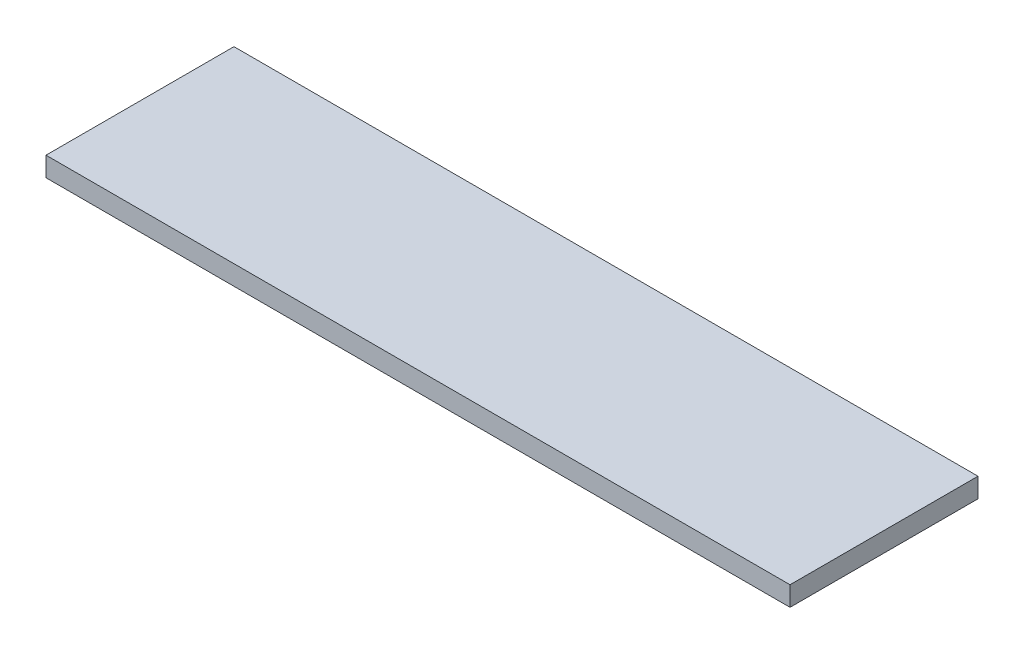
ISO-10303-21;
HEADER;
FILE_DESCRIPTION(('STEP AP214'),'2;1');
FILE_NAME('part.step','',(''),(''),'','','');
FILE_SCHEMA(('AUTOMOTIVE_DESIGN { 1 0 10303 214 1 1 1 1 }'));
ENDSEC;
DATA;
#1=APPLICATION_CONTEXT('core data for automotive mechanical design processes');
#2=APPLICATION_PROTOCOL_DEFINITION('international standard','automotive_design',2000,#1);
#3=PRODUCT_CONTEXT('',#1,'mechanical');
#4=PRODUCT('Part','Part','',(#3));
#5=PRODUCT_RELATED_PRODUCT_CATEGORY('part','',(#4));
#6=PRODUCT_DEFINITION_FORMATION('','',#4);
#7=PRODUCT_DEFINITION_CONTEXT('part definition',#1,'design');
#8=PRODUCT_DEFINITION('design','',#6,#7);
#9=PRODUCT_DEFINITION_SHAPE('','',#8);
#10=(LENGTH_UNIT() NAMED_UNIT(*) SI_UNIT(.MILLI.,.METRE.));
#11=(NAMED_UNIT(*) PLANE_ANGLE_UNIT() SI_UNIT($,.RADIAN.));
#12=(NAMED_UNIT(*) SI_UNIT($,.STERADIAN.) SOLID_ANGLE_UNIT());
#13=UNCERTAINTY_MEASURE_WITH_UNIT(LENGTH_MEASURE(1.E-05),#10,'distance_accuracy_value','');
#14=(GEOMETRIC_REPRESENTATION_CONTEXT(3) GLOBAL_UNCERTAINTY_ASSIGNED_CONTEXT((#13)) GLOBAL_UNIT_ASSIGNED_CONTEXT((#10,
#11,#12)) REPRESENTATION_CONTEXT('',''));
#15=CARTESIAN_POINT('',(0.,0.,0.));
#16=DIRECTION('',(0.,0.,1.));
#17=DIRECTION('',(1.,0.,0.));
#18=AXIS2_PLACEMENT_3D('',#15,#16,#17);
#19=CARTESIAN_POINT('',(2413.,127.,-609.6));
#20=DIRECTION('',(-1.,0.,0.));
#21=DIRECTION('',(0.,0.,1.));
#22=AXIS2_PLACEMENT_3D('',#19,#20,#21);
#23=PLANE('',#22);
#24=DIRECTION('',(0.,0.,-1.));
#25=VECTOR('',#24,1.);
#26=CARTESIAN_POINT('',(2413.,0.,-609.6));
#27=LINE('',#26,#25);
#28=CARTESIAN_POINT('',(2413.,0.,609.6));
#29=VERTEX_POINT('',#28);
#30=CARTESIAN_POINT('',(2413.,0.,-609.6));
#31=VERTEX_POINT('',#30);
#32=EDGE_CURVE('E106',#29,#31,#27,.T.);
#33=ORIENTED_EDGE('',*,*,#32,.T.);
#34=DIRECTION('',(0.,-1.,0.));
#35=VECTOR('',#34,1.);
#36=CARTESIAN_POINT('',(2413.,127.,-609.6));
#37=LINE('',#36,#35);
#38=CARTESIAN_POINT('',(2413.,127.,-609.6));
#39=VERTEX_POINT('',#38);
#40=EDGE_CURVE('E11',#39,#31,#37,.T.);
#41=ORIENTED_EDGE('',*,*,#40,.F.);
#42=DIRECTION('',(0.,0.,-1.));
#43=VECTOR('',#42,1.);
#44=CARTESIAN_POINT('',(2413.,127.,-609.6));
#45=LINE('',#44,#43);
#46=CARTESIAN_POINT('',(2413.,127.,609.6));
#47=VERTEX_POINT('',#46);
#48=EDGE_CURVE('E90',#47,#39,#45,.T.);
#49=ORIENTED_EDGE('',*,*,#48,.F.);
#50=DIRECTION('',(0.,-1.,0.));
#51=VECTOR('',#50,1.);
#52=CARTESIAN_POINT('',(2413.,127.,609.6));
#53=LINE('',#52,#51);
#54=EDGE_CURVE('E102',#47,#29,#53,.T.);
#55=ORIENTED_EDGE('',*,*,#54,.T.);
#56=EDGE_LOOP('',(#33,#41,#49,#55));
#57=FACE_BOUND('',#56,.T.);
#58=ADVANCED_FACE('F38',(#57),#23,.F.);
#59=CARTESIAN_POINT('',(-2413.,127.,-609.6));
#60=DIRECTION('',(0.,0.,1.));
#61=DIRECTION('',(1.,0.,0.));
#62=AXIS2_PLACEMENT_3D('',#59,#60,#61);
#63=PLANE('',#62);
#64=DIRECTION('',(-1.,0.,0.));
#65=VECTOR('',#64,1.);
#66=CARTESIAN_POINT('',(-2413.,0.,-609.6));
#67=LINE('',#66,#65);
#68=CARTESIAN_POINT('',(-2413.,0.,-609.6));
#69=VERTEX_POINT('',#68);
#70=EDGE_CURVE('E95',#31,#69,#67,.T.);
#71=ORIENTED_EDGE('',*,*,#70,.T.);
#72=DIRECTION('',(0.,-1.,0.));
#73=VECTOR('',#72,1.);
#74=CARTESIAN_POINT('',(-2413.,127.,-609.6));
#75=LINE('',#74,#73);
#76=CARTESIAN_POINT('',(-2413.,127.,-609.6));
#77=VERTEX_POINT('',#76);
#78=EDGE_CURVE('E47',#77,#69,#75,.T.);
#79=ORIENTED_EDGE('',*,*,#78,.F.);
#80=DIRECTION('',(-1.,0.,0.));
#81=VECTOR('',#80,1.);
#82=CARTESIAN_POINT('',(-2413.,127.,-609.6));
#83=LINE('',#82,#81);
#84=EDGE_CURVE('E85',#39,#77,#83,.T.);
#85=ORIENTED_EDGE('',*,*,#84,.F.);
#86=ORIENTED_EDGE('',*,*,#40,.T.);
#87=EDGE_LOOP('',(#71,#79,#85,#86));
#88=FACE_BOUND('',#87,.T.);
#89=ADVANCED_FACE('F94',(#88),#63,.F.);
#90=CARTESIAN_POINT('',(-2413.,127.,-609.6));
#91=DIRECTION('',(1.,0.,0.));
#92=DIRECTION('',(0.,0.,-1.));
#93=AXIS2_PLACEMENT_3D('',#90,#91,#92);
#94=PLANE('',#93);
#95=DIRECTION('',(0.,0.,1.));
#96=VECTOR('',#95,1.);
#97=CARTESIAN_POINT('',(-2413.,0.,-609.6));
#98=LINE('',#97,#96);
#99=CARTESIAN_POINT('',(-2413.,0.,609.6));
#100=VERTEX_POINT('',#99);
#101=EDGE_CURVE('E72',#69,#100,#98,.T.);
#102=ORIENTED_EDGE('',*,*,#101,.T.);
#103=DIRECTION('',(0.,-1.,0.));
#104=VECTOR('',#103,1.);
#105=CARTESIAN_POINT('',(-2413.,127.,609.6));
#106=LINE('',#105,#104);
#107=CARTESIAN_POINT('',(-2413.,127.,609.6));
#108=VERTEX_POINT('',#107);
#109=EDGE_CURVE('E97',#108,#100,#106,.T.);
#110=ORIENTED_EDGE('',*,*,#109,.F.);
#111=DIRECTION('',(0.,0.,1.));
#112=VECTOR('',#111,1.);
#113=CARTESIAN_POINT('',(-2413.,127.,-609.6));
#114=LINE('',#113,#112);
#115=EDGE_CURVE('E88',#77,#108,#114,.T.);
#116=ORIENTED_EDGE('',*,*,#115,.F.);
#117=ORIENTED_EDGE('',*,*,#78,.T.);
#118=EDGE_LOOP('',(#102,#110,#116,#117));
#119=FACE_BOUND('',#118,.T.);
#120=ADVANCED_FACE('F98',(#119),#94,.F.);
#121=CARTESIAN_POINT('',(-2413.,127.,609.6));
#122=DIRECTION('',(0.,0.,-1.));
#123=DIRECTION('',(-1.,0.,0.));
#124=AXIS2_PLACEMENT_3D('',#121,#122,#123);
#125=PLANE('',#124);
#126=DIRECTION('',(1.,0.,0.));
#127=VECTOR('',#126,1.);
#128=CARTESIAN_POINT('',(-2413.,0.,609.6));
#129=LINE('',#128,#127);
#130=EDGE_CURVE('E78',#100,#29,#129,.T.);
#131=ORIENTED_EDGE('',*,*,#130,.T.);
#132=ORIENTED_EDGE('',*,*,#54,.F.);
#133=DIRECTION('',(1.,0.,0.));
#134=VECTOR('',#133,1.);
#135=CARTESIAN_POINT('',(-2413.,127.,609.6));
#136=LINE('',#135,#134);
#137=EDGE_CURVE('E55',#108,#47,#136,.T.);
#138=ORIENTED_EDGE('',*,*,#137,.F.);
#139=ORIENTED_EDGE('',*,*,#109,.T.);
#140=EDGE_LOOP('',(#131,#132,#138,#139));
#141=FACE_BOUND('',#140,.T.);
#142=ADVANCED_FACE('F119',(#141),#125,.F.);
#143=CARTESIAN_POINT('',(0.,127.,0.));
#144=DIRECTION('',(0.,1.,0.));
#145=DIRECTION('',(0.,0.,1.));
#146=AXIS2_PLACEMENT_3D('',#143,#144,#145);
#147=PLANE('',#146);
#148=ORIENTED_EDGE('',*,*,#48,.T.);
#149=ORIENTED_EDGE('',*,*,#84,.T.);
#150=ORIENTED_EDGE('',*,*,#115,.T.);
#151=ORIENTED_EDGE('',*,*,#137,.T.);
#152=EDGE_LOOP('',(#148,#149,#150,#151));
#153=FACE_BOUND('',#152,.T.);
#154=ADVANCED_FACE('F86',(#153),#147,.T.);
#155=CARTESIAN_POINT('',(0.,0.,0.));
#156=DIRECTION('',(0.,1.,0.));
#157=DIRECTION('',(0.,0.,1.));
#158=AXIS2_PLACEMENT_3D('',#155,#156,#157);
#159=PLANE('',#158);
#160=ORIENTED_EDGE('',*,*,#32,.F.);
#161=ORIENTED_EDGE('',*,*,#130,.F.);
#162=ORIENTED_EDGE('',*,*,#101,.F.);
#163=ORIENTED_EDGE('',*,*,#70,.F.);
#164=EDGE_LOOP('',(#160,#161,#162,#163));
#165=FACE_BOUND('',#164,.T.);
#166=ADVANCED_FACE('F122',(#165),#159,.F.);
#167=CLOSED_SHELL('',(#58,#89,#120,#142,#154,#166));
#168=MANIFOLD_SOLID_BREP('B2',#167);
#169=ADVANCED_BREP_SHAPE_REPRESENTATION('',(#18,#168),#14);
#170=SHAPE_DEFINITION_REPRESENTATION(#9,#169);
ENDSEC;
END-ISO-10303-21;
